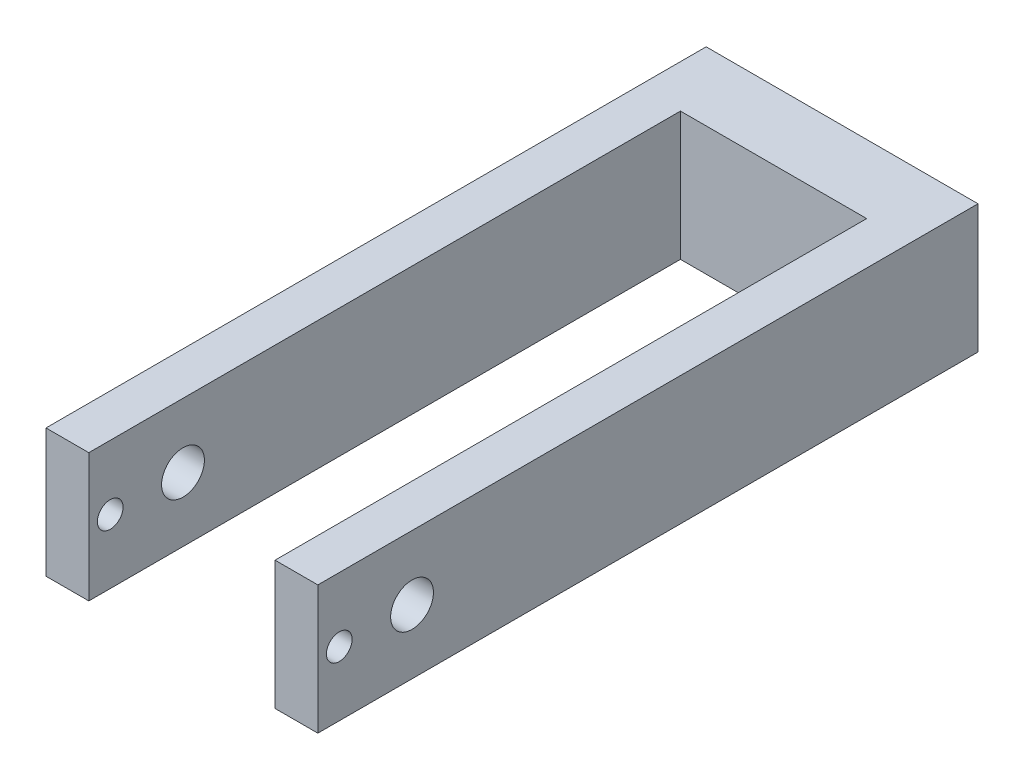
ISO-10303-21;
HEADER;
FILE_DESCRIPTION(('STEP AP214'),'2;1');
FILE_NAME('part.step','',(''),(''),'','','');
FILE_SCHEMA(('AUTOMOTIVE_DESIGN { 1 0 10303 214 1 1 1 1 }'));
ENDSEC;
DATA;
#1=APPLICATION_CONTEXT('core data for automotive mechanical design processes');
#2=APPLICATION_PROTOCOL_DEFINITION('international standard','automotive_design',2000,#1);
#3=PRODUCT_CONTEXT('',#1,'mechanical');
#4=PRODUCT('Part','Part','',(#3));
#5=PRODUCT_RELATED_PRODUCT_CATEGORY('part','',(#4));
#6=PRODUCT_DEFINITION_FORMATION('','',#4);
#7=PRODUCT_DEFINITION_CONTEXT('part definition',#1,'design');
#8=PRODUCT_DEFINITION('design','',#6,#7);
#9=PRODUCT_DEFINITION_SHAPE('','',#8);
#10=(LENGTH_UNIT() NAMED_UNIT(*) SI_UNIT(.MILLI.,.METRE.));
#11=(NAMED_UNIT(*) PLANE_ANGLE_UNIT() SI_UNIT($,.RADIAN.));
#12=(NAMED_UNIT(*) SI_UNIT($,.STERADIAN.) SOLID_ANGLE_UNIT());
#13=UNCERTAINTY_MEASURE_WITH_UNIT(LENGTH_MEASURE(1.E-05),#10,'distance_accuracy_value','');
#14=(GEOMETRIC_REPRESENTATION_CONTEXT(3) GLOBAL_UNCERTAINTY_ASSIGNED_CONTEXT((#13)) GLOBAL_UNIT_ASSIGNED_CONTEXT((#10,
#11,#12)) REPRESENTATION_CONTEXT('',''));
#15=CARTESIAN_POINT('',(0.,0.,0.));
#16=DIRECTION('',(0.,0.,1.));
#17=DIRECTION('',(1.,0.,0.));
#18=AXIS2_PLACEMENT_3D('',#15,#16,#17);
#19=CARTESIAN_POINT('',(0.,0.,8.));
#20=DIRECTION('',(0.,0.,-1.));
#21=DIRECTION('',(-1.,0.,0.));
#22=AXIS2_PLACEMENT_3D('',#19,#20,#21);
#23=PLANE('',#22);
#24=DIRECTION('',(0.,-1.,0.));
#25=VECTOR('',#24,1.);
#26=CARTESIAN_POINT('',(9.94864788732204,8.16903118461885,8.));
#27=LINE('',#26,#25);
#28=CARTESIAN_POINT('',(9.94864788732204,8.16903118461885,8.));
#29=VERTEX_POINT('',#28);
#30=CARTESIAN_POINT('',(9.94864788732204,-6.83096881538115,8.));
#31=VERTEX_POINT('',#30);
#32=EDGE_CURVE('E123',#29,#31,#27,.T.);
#33=ORIENTED_EDGE('',*,*,#32,.F.);
#34=DIRECTION('',(-1.,0.,0.));
#35=VECTOR('',#34,1.);
#36=CARTESIAN_POINT('',(-16.801352112678,8.16903118461885,8.));
#37=LINE('',#36,#35);
#38=CARTESIAN_POINT('',(-11.801352112678,8.16903118461885,8.));
#39=VERTEX_POINT('',#38);
#40=EDGE_CURVE('E155',#29,#39,#37,.T.);
#41=ORIENTED_EDGE('',*,*,#40,.T.);
#42=DIRECTION('',(0.,1.,0.));
#43=VECTOR('',#42,1.);
#44=CARTESIAN_POINT('',(-11.801352112678,8.16903118461885,8.));
#45=LINE('',#44,#43);
#46=CARTESIAN_POINT('',(-11.801352112678,-6.83096881538115,8.));
#47=VERTEX_POINT('',#46);
#48=EDGE_CURVE('E54',#47,#39,#45,.T.);
#49=ORIENTED_EDGE('',*,*,#48,.F.);
#50=DIRECTION('',(1.,0.,0.));
#51=VECTOR('',#50,1.);
#52=CARTESIAN_POINT('',(14.948647887322,-6.83096881538115,8.));
#53=LINE('',#52,#51);
#54=EDGE_CURVE('E49',#47,#31,#53,.T.);
#55=ORIENTED_EDGE('',*,*,#54,.T.);
#56=EDGE_LOOP('',(#33,#41,#49,#55));
#57=FACE_BOUND('',#56,.T.);
#58=ADVANCED_FACE('F32',(#57),#23,.F.);
#59=CARTESIAN_POINT('',(-16.801352112678,-6.83096881538115,8.));
#60=DIRECTION('',(1.,0.,0.));
#61=DIRECTION('',(0.,1.,0.));
#62=AXIS2_PLACEMENT_3D('',#59,#60,#61);
#63=PLANE('',#62);
#64=CARTESIAN_POINT('',(-16.801352112678,0.669031184618845,74.6));
#65=DIRECTION('',(1.,0.,0.));
#66=DIRECTION('',(0.,1.,0.));
#67=AXIS2_PLACEMENT_3D('',#64,#65,#66);
#68=CIRCLE('',#67,1.5);
#69=CARTESIAN_POINT('',(-16.801352112678,2.16903118461884,74.6));
#70=VERTEX_POINT('',#69);
#71=EDGE_CURVE('E194',#70,#70,#68,.T.);
#72=ORIENTED_EDGE('',*,*,#71,.T.);
#73=EDGE_LOOP('',(#72));
#74=FACE_BOUND('',#73,.T.);
#75=CARTESIAN_POINT('',(-16.801352112678,0.669031184618845,66.1));
#76=DIRECTION('',(1.,0.,0.));
#77=DIRECTION('',(0.,1.,0.));
#78=AXIS2_PLACEMENT_3D('',#75,#76,#77);
#79=CIRCLE('',#78,2.50000000000001);
#80=CARTESIAN_POINT('',(-16.801352112678,3.16903118461885,66.1));
#81=VERTEX_POINT('',#80);
#82=EDGE_CURVE('E125',#81,#81,#79,.T.);
#83=ORIENTED_EDGE('',*,*,#82,.T.);
#84=EDGE_LOOP('',(#83));
#85=FACE_BOUND('',#84,.T.);
#86=DIRECTION('',(0.,-1.,0.));
#87=VECTOR('',#86,1.);
#88=CARTESIAN_POINT('',(-16.801352112678,-6.83096881538115,0.));
#89=LINE('',#88,#87);
#90=CARTESIAN_POINT('',(-16.801352112678,8.16903118461885,0.));
#91=VERTEX_POINT('',#90);
#92=CARTESIAN_POINT('',(-16.801352112678,-6.83096881538115,0.));
#93=VERTEX_POINT('',#92);
#94=EDGE_CURVE('E153',#91,#93,#89,.T.);
#95=ORIENTED_EDGE('',*,*,#94,.T.);
#96=DIRECTION('',(0.,0.,-1.));
#97=VECTOR('',#96,1.);
#98=CARTESIAN_POINT('',(-16.801352112678,-6.83096881538115,8.));
#99=LINE('',#98,#97);
#100=CARTESIAN_POINT('',(-16.801352112678,-6.83096881538115,77.1));
#101=VERTEX_POINT('',#100);
#102=EDGE_CURVE('E11',#101,#93,#99,.T.);
#103=ORIENTED_EDGE('',*,*,#102,.F.);
#104=DIRECTION('',(0.,-1.,0.));
#105=VECTOR('',#104,1.);
#106=CARTESIAN_POINT('',(-16.801352112678,-6.83096881538115,77.1));
#107=LINE('',#106,#105);
#108=CARTESIAN_POINT('',(-16.801352112678,8.16903118461885,77.1));
#109=VERTEX_POINT('',#108);
#110=EDGE_CURVE('E136',#109,#101,#107,.T.);
#111=ORIENTED_EDGE('',*,*,#110,.F.);
#112=DIRECTION('',(0.,0.,-1.));
#113=VECTOR('',#112,1.);
#114=CARTESIAN_POINT('',(-16.801352112678,8.16903118461885,8.));
#115=LINE('',#114,#113);
#116=EDGE_CURVE('E108',#109,#91,#115,.T.);
#117=ORIENTED_EDGE('',*,*,#116,.T.);
#118=EDGE_LOOP('',(#95,#103,#111,#117));
#119=FACE_BOUND('',#118,.T.);
#120=ADVANCED_FACE('F34',(#74,#85,#119),#63,.F.);
#121=CARTESIAN_POINT('',(14.948647887322,-6.83096881538115,8.));
#122=DIRECTION('',(0.,1.,0.));
#123=DIRECTION('',(-1.,0.,0.));
#124=AXIS2_PLACEMENT_3D('',#121,#122,#123);
#125=PLANE('',#124);
#126=CARTESIAN_POINT('',(-0.926352112677958,-6.83096881538115,4.));
#127=DIRECTION('',(0.,-1.,0.));
#128=DIRECTION('',(1.,0.,0.));
#129=AXIS2_PLACEMENT_3D('',#126,#127,#128);
#130=CIRCLE('',#129,1.5);
#131=CARTESIAN_POINT('',(0.573647887322042,-6.83096881538115,4.));
#132=VERTEX_POINT('',#131);
#133=EDGE_CURVE('E191',#132,#132,#130,.T.);
#134=ORIENTED_EDGE('',*,*,#133,.F.);
#135=EDGE_LOOP('',(#134));
#136=FACE_BOUND('',#135,.T.);
#137=DIRECTION('',(1.,0.,0.));
#138=VECTOR('',#137,1.);
#139=CARTESIAN_POINT('',(14.948647887322,-6.83096881538115,0.));
#140=LINE('',#139,#138);
#141=CARTESIAN_POINT('',(14.948647887322,-6.83096881538115,0.));
#142=VERTEX_POINT('',#141);
#143=EDGE_CURVE('E160',#93,#142,#140,.T.);
#144=ORIENTED_EDGE('',*,*,#143,.T.);
#145=DIRECTION('',(0.,0.,-1.));
#146=VECTOR('',#145,1.);
#147=CARTESIAN_POINT('',(14.948647887322,-6.83096881538115,8.));
#148=LINE('',#147,#146);
#149=CARTESIAN_POINT('',(14.948647887322,-6.83096881538115,77.1));
#150=VERTEX_POINT('',#149);
#151=EDGE_CURVE('E41',#150,#142,#148,.T.);
#152=ORIENTED_EDGE('',*,*,#151,.F.);
#153=DIRECTION('',(1.,0.,0.));
#154=VECTOR('',#153,1.);
#155=CARTESIAN_POINT('',(9.94864788732204,-6.83096881538115,77.1));
#156=LINE('',#155,#154);
#157=CARTESIAN_POINT('',(9.94864788732204,-6.83096881538115,77.1));
#158=VERTEX_POINT('',#157);
#159=EDGE_CURVE('E122',#158,#150,#156,.T.);
#160=ORIENTED_EDGE('',*,*,#159,.F.);
#161=DIRECTION('',(0.,0.,-1.));
#162=VECTOR('',#161,1.);
#163=CARTESIAN_POINT('',(9.94864788732204,-6.83096881538115,77.1));
#164=LINE('',#163,#162);
#165=EDGE_CURVE('E131',#158,#31,#164,.T.);
#166=ORIENTED_EDGE('',*,*,#165,.T.);
#167=ORIENTED_EDGE('',*,*,#54,.F.);
#168=DIRECTION('',(0.,0.,-1.));
#169=VECTOR('',#168,1.);
#170=CARTESIAN_POINT('',(-11.801352112678,-6.83096881538115,77.1));
#171=LINE('',#170,#169);
#172=CARTESIAN_POINT('',(-11.801352112678,-6.83096881538115,77.1));
#173=VERTEX_POINT('',#172);
#174=EDGE_CURVE('E150',#173,#47,#171,.T.);
#175=ORIENTED_EDGE('',*,*,#174,.F.);
#176=DIRECTION('',(1.,0.,0.));
#177=VECTOR('',#176,1.);
#178=CARTESIAN_POINT('',(-11.801352112678,-6.83096881538115,77.1));
#179=LINE('',#178,#177);
#180=EDGE_CURVE('E139',#101,#173,#179,.T.);
#181=ORIENTED_EDGE('',*,*,#180,.F.);
#182=ORIENTED_EDGE('',*,*,#102,.T.);
#183=EDGE_LOOP('',(#144,#152,#160,#166,#167,#175,#181,#182));
#184=FACE_BOUND('',#183,.T.);
#185=ADVANCED_FACE('F230',(#136,#184),#125,.F.);
#186=CARTESIAN_POINT('',(14.948647887322,8.16903118461885,8.));
#187=DIRECTION('',(-1.,0.,0.));
#188=DIRECTION('',(0.,-1.,0.));
#189=AXIS2_PLACEMENT_3D('',#186,#187,#188);
#190=PLANE('',#189);
#191=CARTESIAN_POINT('',(14.948647887322,0.669031184618852,74.6));
#192=DIRECTION('',(1.,0.,0.));
#193=DIRECTION('',(0.,1.,0.));
#194=AXIS2_PLACEMENT_3D('',#191,#192,#193);
#195=CIRCLE('',#194,1.5);
#196=CARTESIAN_POINT('',(14.948647887322,2.16903118461885,74.6));
#197=VERTEX_POINT('',#196);
#198=EDGE_CURVE('E202',#197,#197,#195,.T.);
#199=ORIENTED_EDGE('',*,*,#198,.F.);
#200=EDGE_LOOP('',(#199));
#201=FACE_BOUND('',#200,.T.);
#202=CARTESIAN_POINT('',(14.948647887322,0.669031184618852,66.1));
#203=DIRECTION('',(1.,0.,0.));
#204=DIRECTION('',(0.,1.,0.));
#205=AXIS2_PLACEMENT_3D('',#202,#203,#204);
#206=CIRCLE('',#205,2.50000000000001);
#207=CARTESIAN_POINT('',(14.948647887322,3.16903118461886,66.1));
#208=VERTEX_POINT('',#207);
#209=EDGE_CURVE('E169',#208,#208,#206,.T.);
#210=ORIENTED_EDGE('',*,*,#209,.F.);
#211=EDGE_LOOP('',(#210));
#212=FACE_BOUND('',#211,.T.);
#213=DIRECTION('',(0.,1.,0.));
#214=VECTOR('',#213,1.);
#215=CARTESIAN_POINT('',(14.948647887322,8.16903118461885,0.));
#216=LINE('',#215,#214);
#217=CARTESIAN_POINT('',(14.948647887322,8.16903118461885,0.));
#218=VERTEX_POINT('',#217);
#219=EDGE_CURVE('E105',#142,#218,#216,.T.);
#220=ORIENTED_EDGE('',*,*,#219,.T.);
#221=DIRECTION('',(0.,0.,-1.));
#222=VECTOR('',#221,1.);
#223=CARTESIAN_POINT('',(14.948647887322,8.16903118461885,8.));
#224=LINE('',#223,#222);
#225=CARTESIAN_POINT('',(14.948647887322,8.16903118461885,77.1));
#226=VERTEX_POINT('',#225);
#227=EDGE_CURVE('E98',#226,#218,#224,.T.);
#228=ORIENTED_EDGE('',*,*,#227,.F.);
#229=DIRECTION('',(0.,1.,0.));
#230=VECTOR('',#229,1.);
#231=CARTESIAN_POINT('',(14.948647887322,-6.83096881538115,77.1));
#232=LINE('',#231,#230);
#233=EDGE_CURVE('E103',#150,#226,#232,.T.);
#234=ORIENTED_EDGE('',*,*,#233,.F.);
#235=ORIENTED_EDGE('',*,*,#151,.T.);
#236=EDGE_LOOP('',(#220,#228,#234,#235));
#237=FACE_BOUND('',#236,.T.);
#238=ADVANCED_FACE('F100',(#201,#212,#237),#190,.F.);
#239=CARTESIAN_POINT('',(-16.801352112678,8.16903118461885,8.));
#240=DIRECTION('',(0.,-1.,0.));
#241=DIRECTION('',(0.,0.,-1.));
#242=AXIS2_PLACEMENT_3D('',#239,#240,#241);
#243=PLANE('',#242);
#244=DIRECTION('',(-1.,0.,0.));
#245=VECTOR('',#244,1.);
#246=CARTESIAN_POINT('',(-16.801352112678,8.16903118461885,0.));
#247=LINE('',#246,#245);
#248=EDGE_CURVE('E156',#218,#91,#247,.T.);
#249=ORIENTED_EDGE('',*,*,#248,.T.);
#250=ORIENTED_EDGE('',*,*,#116,.F.);
#251=DIRECTION('',(-1.,0.,0.));
#252=VECTOR('',#251,1.);
#253=CARTESIAN_POINT('',(-16.801352112678,8.16903118461885,77.1));
#254=LINE('',#253,#252);
#255=CARTESIAN_POINT('',(-11.801352112678,8.16903118461885,77.1));
#256=VERTEX_POINT('',#255);
#257=EDGE_CURVE('E143',#256,#109,#254,.T.);
#258=ORIENTED_EDGE('',*,*,#257,.F.);
#259=DIRECTION('',(0.,0.,-1.));
#260=VECTOR('',#259,1.);
#261=CARTESIAN_POINT('',(-11.801352112678,8.16903118461885,77.1));
#262=LINE('',#261,#260);
#263=EDGE_CURVE('E146',#256,#39,#262,.T.);
#264=ORIENTED_EDGE('',*,*,#263,.T.);
#265=ORIENTED_EDGE('',*,*,#40,.F.);
#266=DIRECTION('',(0.,0.,-1.));
#267=VECTOR('',#266,1.);
#268=CARTESIAN_POINT('',(9.94864788732204,8.16903118461885,77.1));
#269=LINE('',#268,#267);
#270=CARTESIAN_POINT('',(9.94864788732204,8.16903118461885,77.1));
#271=VERTEX_POINT('',#270);
#272=EDGE_CURVE('E114',#271,#29,#269,.T.);
#273=ORIENTED_EDGE('',*,*,#272,.F.);
#274=DIRECTION('',(-1.,0.,0.));
#275=VECTOR('',#274,1.);
#276=CARTESIAN_POINT('',(14.948647887322,8.16903118461885,77.1));
#277=LINE('',#276,#275);
#278=EDGE_CURVE('E111',#226,#271,#277,.T.);
#279=ORIENTED_EDGE('',*,*,#278,.F.);
#280=ORIENTED_EDGE('',*,*,#227,.T.);
#281=EDGE_LOOP('',(#249,#250,#258,#264,#265,#273,#279,#280));
#282=FACE_BOUND('',#281,.T.);
#283=ADVANCED_FACE('F112',(#282),#243,.F.);
#284=CARTESIAN_POINT('',(0.,0.,0.));
#285=DIRECTION('',(0.,0.,-1.));
#286=DIRECTION('',(-1.,0.,0.));
#287=AXIS2_PLACEMENT_3D('',#284,#285,#286);
#288=PLANE('',#287);
#289=CARTESIAN_POINT('',(-0.926352112677959,0.66903118461885,0.));
#290=DIRECTION('',(0.,0.,-1.));
#291=DIRECTION('',(-1.,0.,0.));
#292=AXIS2_PLACEMENT_3D('',#289,#290,#291);
#293=CIRCLE('',#292,4.);
#294=CARTESIAN_POINT('',(-4.92635211267796,0.66903118461885,0.));
#295=VERTEX_POINT('',#294);
#296=EDGE_CURVE('E179',#295,#295,#293,.T.);
#297=ORIENTED_EDGE('',*,*,#296,.F.);
#298=EDGE_LOOP('',(#297));
#299=FACE_BOUND('',#298,.T.);
#300=ORIENTED_EDGE('',*,*,#94,.F.);
#301=ORIENTED_EDGE('',*,*,#248,.F.);
#302=ORIENTED_EDGE('',*,*,#219,.F.);
#303=ORIENTED_EDGE('',*,*,#143,.F.);
#304=EDGE_LOOP('',(#300,#301,#302,#303));
#305=FACE_BOUND('',#304,.T.);
#306=ADVANCED_FACE('F236',(#299,#305),#288,.T.);
#307=CARTESIAN_POINT('',(-11.801352112678,8.16903118461885,77.1));
#308=DIRECTION('',(-1.,0.,0.));
#309=DIRECTION('',(0.,-1.,0.));
#310=AXIS2_PLACEMENT_3D('',#307,#308,#309);
#311=PLANE('',#310);
#312=CARTESIAN_POINT('',(-11.801352112678,0.669031184618846,74.6));
#313=DIRECTION('',(-1.,0.,0.));
#314=DIRECTION('',(0.,-1.,0.));
#315=AXIS2_PLACEMENT_3D('',#312,#313,#314);
#316=CIRCLE('',#315,1.5);
#317=CARTESIAN_POINT('',(-11.801352112678,-0.830968815381151,74.6));
#318=VERTEX_POINT('',#317);
#319=EDGE_CURVE('E199',#318,#318,#316,.T.);
#320=ORIENTED_EDGE('',*,*,#319,.T.);
#321=EDGE_LOOP('',(#320));
#322=FACE_BOUND('',#321,.T.);
#323=CARTESIAN_POINT('',(-11.801352112678,0.669031184618846,66.1));
#324=DIRECTION('',(-1.,0.,0.));
#325=DIRECTION('',(0.,-1.,0.));
#326=AXIS2_PLACEMENT_3D('',#323,#324,#325);
#327=CIRCLE('',#326,2.50000000000001);
#328=CARTESIAN_POINT('',(-11.801352112678,-1.83096881538116,66.1));
#329=VERTEX_POINT('',#328);
#330=EDGE_CURVE('E168',#329,#329,#327,.T.);
#331=ORIENTED_EDGE('',*,*,#330,.T.);
#332=EDGE_LOOP('',(#331));
#333=FACE_BOUND('',#332,.T.);
#334=ORIENTED_EDGE('',*,*,#48,.T.);
#335=ORIENTED_EDGE('',*,*,#263,.F.);
#336=DIRECTION('',(0.,1.,0.));
#337=VECTOR('',#336,1.);
#338=CARTESIAN_POINT('',(-11.801352112678,8.16903118461885,77.1));
#339=LINE('',#338,#337);
#340=EDGE_CURVE('E141',#173,#256,#339,.T.);
#341=ORIENTED_EDGE('',*,*,#340,.F.);
#342=ORIENTED_EDGE('',*,*,#174,.T.);
#343=EDGE_LOOP('',(#334,#335,#341,#342));
#344=FACE_BOUND('',#343,.T.);
#345=ADVANCED_FACE('F234',(#322,#333,#344),#311,.F.);
#346=CARTESIAN_POINT('',(0.,0.,77.1));
#347=DIRECTION('',(0.,0.,-1.));
#348=DIRECTION('',(-1.,0.,0.));
#349=AXIS2_PLACEMENT_3D('',#346,#347,#348);
#350=PLANE('',#349);
#351=ORIENTED_EDGE('',*,*,#110,.T.);
#352=ORIENTED_EDGE('',*,*,#180,.T.);
#353=ORIENTED_EDGE('',*,*,#340,.T.);
#354=ORIENTED_EDGE('',*,*,#257,.T.);
#355=EDGE_LOOP('',(#351,#352,#353,#354));
#356=FACE_BOUND('',#355,.T.);
#357=ADVANCED_FACE('F259',(#356),#350,.F.);
#358=CARTESIAN_POINT('',(9.94864788732204,8.16903118461885,77.1));
#359=DIRECTION('',(1.,0.,0.));
#360=DIRECTION('',(0.,1.,0.));
#361=AXIS2_PLACEMENT_3D('',#358,#359,#360);
#362=PLANE('',#361);
#363=CARTESIAN_POINT('',(9.94864788732204,0.669031184618851,74.6));
#364=DIRECTION('',(1.,0.,0.));
#365=DIRECTION('',(0.,1.,0.));
#366=AXIS2_PLACEMENT_3D('',#363,#364,#365);
#367=CIRCLE('',#366,1.5);
#368=CARTESIAN_POINT('',(9.94864788732204,2.16903118461885,74.6));
#369=VERTEX_POINT('',#368);
#370=EDGE_CURVE('E36',#369,#369,#367,.T.);
#371=ORIENTED_EDGE('',*,*,#370,.T.);
#372=EDGE_LOOP('',(#371));
#373=FACE_BOUND('',#372,.T.);
#374=CARTESIAN_POINT('',(9.94864788732204,0.669031184618851,66.1));
#375=DIRECTION('',(1.,0.,0.));
#376=DIRECTION('',(0.,1.,0.));
#377=AXIS2_PLACEMENT_3D('',#374,#375,#376);
#378=CIRCLE('',#377,2.50000000000001);
#379=CARTESIAN_POINT('',(9.94864788732204,3.16903118461886,66.1));
#380=VERTEX_POINT('',#379);
#381=EDGE_CURVE('E166',#380,#380,#378,.T.);
#382=ORIENTED_EDGE('',*,*,#381,.T.);
#383=EDGE_LOOP('',(#382));
#384=FACE_BOUND('',#383,.T.);
#385=ORIENTED_EDGE('',*,*,#32,.T.);
#386=ORIENTED_EDGE('',*,*,#165,.F.);
#387=DIRECTION('',(0.,-1.,0.));
#388=VECTOR('',#387,1.);
#389=CARTESIAN_POINT('',(9.94864788732204,8.16903118461885,77.1));
#390=LINE('',#389,#388);
#391=EDGE_CURVE('E117',#271,#158,#390,.T.);
#392=ORIENTED_EDGE('',*,*,#391,.F.);
#393=ORIENTED_EDGE('',*,*,#272,.T.);
#394=EDGE_LOOP('',(#385,#386,#392,#393));
#395=FACE_BOUND('',#394,.T.);
#396=ADVANCED_FACE('F209',(#373,#384,#395),#362,.F.);
#397=CARTESIAN_POINT('',(0.,0.,77.1));
#398=DIRECTION('',(0.,0.,1.));
#399=DIRECTION('',(1.,0.,0.));
#400=AXIS2_PLACEMENT_3D('',#397,#398,#399);
#401=PLANE('',#400);
#402=ORIENTED_EDGE('',*,*,#233,.T.);
#403=ORIENTED_EDGE('',*,*,#278,.T.);
#404=ORIENTED_EDGE('',*,*,#391,.T.);
#405=ORIENTED_EDGE('',*,*,#159,.T.);
#406=EDGE_LOOP('',(#402,#403,#404,#405));
#407=FACE_BOUND('',#406,.T.);
#408=ADVANCED_FACE('F120',(#407),#401,.T.);
#409=CARTESIAN_POINT('',(-54.1513521126779,0.669031184618836,66.1));
#410=DIRECTION('',(1.,0.,0.));
#411=DIRECTION('',(0.,1.,0.));
#412=AXIS2_PLACEMENT_3D('',#409,#410,#411);
#413=CYLINDRICAL_SURFACE('',#412,2.50000000000001);
#414=ORIENTED_EDGE('',*,*,#209,.T.);
#415=EDGE_LOOP('',(#414));
#416=FACE_BOUND('',#415,.T.);
#417=ORIENTED_EDGE('',*,*,#381,.F.);
#418=EDGE_LOOP('',(#417));
#419=FACE_BOUND('',#418,.T.);
#420=ADVANCED_FACE('F272',(#416,#419),#413,.F.);
#421=ORIENTED_EDGE('',*,*,#330,.F.);
#422=EDGE_LOOP('',(#421));
#423=FACE_BOUND('',#422,.T.);
#424=ORIENTED_EDGE('',*,*,#82,.F.);
#425=EDGE_LOOP('',(#424));
#426=FACE_BOUND('',#425,.T.);
#427=ADVANCED_FACE('F276',(#423,#426),#413,.F.);
#428=CARTESIAN_POINT('',(-0.926352112677959,0.66903118461885,4.));
#429=DIRECTION('',(0.,0.,-1.));
#430=DIRECTION('',(-1.,0.,0.));
#431=AXIS2_PLACEMENT_3D('',#428,#429,#430);
#432=CYLINDRICAL_SURFACE('',#431,4.);
#433=CARTESIAN_POINT('',(-0.926352112677959,0.66903118461885,4.));
#434=DIRECTION('',(0.,0.,-1.));
#435=DIRECTION('',(-1.,0.,0.));
#436=AXIS2_PLACEMENT_3D('',#433,#434,#435);
#437=CIRCLE('',#436,4.);
#438=CARTESIAN_POINT('',(-4.92635211267796,0.66903118461885,4.));
#439=VERTEX_POINT('',#438);
#440=EDGE_CURVE('E174',#439,#439,#437,.T.);
#441=ORIENTED_EDGE('',*,*,#440,.F.);
#442=EDGE_LOOP('',(#441));
#443=FACE_BOUND('',#442,.T.);
#444=ORIENTED_EDGE('',*,*,#296,.T.);
#445=EDGE_LOOP('',(#444));
#446=FACE_BOUND('',#445,.T.);
#447=ADVANCED_FACE('F279',(#443,#446),#432,.F.);
#448=CARTESIAN_POINT('',(-0.926352112677959,0.66903118461885,4.));
#449=DIRECTION('',(0.,0.,-1.));
#450=DIRECTION('',(-1.,0.,0.));
#451=AXIS2_PLACEMENT_3D('',#448,#449,#450);
#452=PLANE('',#451);
#453=CARTESIAN_POINT('',(-0.926352112677959,0.66903118461885,4.));
#454=DIRECTION('',(0.,0.,-1.));
#455=DIRECTION('',(-1.,0.,0.));
#456=AXIS2_PLACEMENT_3D('',#453,#454,#455);
#457=CIRCLE('',#456,2.);
#458=CARTESIAN_POINT('',(-2.92635211267796,0.66903118461885,4.));
#459=VERTEX_POINT('',#458);
#460=EDGE_CURVE('E183',#459,#459,#457,.T.);
#461=ORIENTED_EDGE('',*,*,#460,.F.);
#462=EDGE_LOOP('',(#461));
#463=FACE_BOUND('',#462,.T.);
#464=ORIENTED_EDGE('',*,*,#440,.T.);
#465=EDGE_LOOP('',(#464));
#466=FACE_BOUND('',#465,.T.);
#467=ADVANCED_FACE('F283',(#463,#466),#452,.T.);
#468=CARTESIAN_POINT('',(-0.926352112677959,0.66903118461885,4.));
#469=DIRECTION('',(0.,0.,-1.));
#470=DIRECTION('',(-1.,0.,0.));
#471=AXIS2_PLACEMENT_3D('',#468,#469,#470);
#472=CYLINDRICAL_SURFACE('',#471,2.);
#473=ORIENTED_EDGE('',*,*,#460,.T.);
#474=EDGE_LOOP('',(#473));
#475=FACE_BOUND('',#474,.T.);
#476=CARTESIAN_POINT('',(-0.926352112677959,0.66903118461885,0.));
#477=DIRECTION('',(0.,0.,-1.));
#478=DIRECTION('',(-1.,0.,0.));
#479=AXIS2_PLACEMENT_3D('',#476,#477,#478);
#480=CIRCLE('',#479,2.);
#481=CARTESIAN_POINT('',(-2.92635211267796,0.66903118461885,0.));
#482=VERTEX_POINT('',#481);
#483=EDGE_CURVE('E185',#482,#482,#480,.T.);
#484=ORIENTED_EDGE('',*,*,#483,.F.);
#485=EDGE_LOOP('',(#484));
#486=FACE_BOUND('',#485,.T.);
#487=ADVANCED_FACE('F287',(#475,#486),#472,.T.);
#488=ORIENTED_EDGE('',*,*,#483,.T.);
#489=EDGE_LOOP('',(#488));
#490=FACE_BOUND('',#489,.T.);
#491=ADVANCED_FACE('F240',(#490),#288,.T.);
#492=CARTESIAN_POINT('',(-0.926352112677959,-3.83096881538115,4.));
#493=DIRECTION('',(0.,-1.,0.));
#494=DIRECTION('',(1.,0.,0.));
#495=AXIS2_PLACEMENT_3D('',#492,#493,#494);
#496=CYLINDRICAL_SURFACE('',#495,1.5);
#497=CARTESIAN_POINT('',(-0.926352112677959,-3.83096881538115,4.));
#498=DIRECTION('',(0.,-1.,0.));
#499=DIRECTION('',(1.,0.,0.));
#500=AXIS2_PLACEMENT_3D('',#497,#498,#499);
#501=CIRCLE('',#500,1.5);
#502=CARTESIAN_POINT('',(0.573647887322042,-3.83096881538115,4.));
#503=VERTEX_POINT('',#502);
#504=EDGE_CURVE('E188',#503,#503,#501,.T.);
#505=ORIENTED_EDGE('',*,*,#504,.F.);
#506=EDGE_LOOP('',(#505));
#507=FACE_BOUND('',#506,.T.);
#508=ORIENTED_EDGE('',*,*,#133,.T.);
#509=EDGE_LOOP('',(#508));
#510=FACE_BOUND('',#509,.T.);
#511=ADVANCED_FACE('F221',(#507,#510),#496,.F.);
#512=CARTESIAN_POINT('',(-0.926352112677959,-3.83096881538115,4.));
#513=DIRECTION('',(0.,-1.,0.));
#514=DIRECTION('',(1.,0.,0.));
#515=AXIS2_PLACEMENT_3D('',#512,#513,#514);
#516=PLANE('',#515);
#517=ORIENTED_EDGE('',*,*,#504,.T.);
#518=EDGE_LOOP('',(#517));
#519=FACE_BOUND('',#518,.T.);
#520=ADVANCED_FACE('F214',(#519),#516,.T.);
#521=CARTESIAN_POINT('',(-22.051352112678,0.669031184618843,74.6));
#522=DIRECTION('',(1.,0.,0.));
#523=DIRECTION('',(0.,1.,0.));
#524=AXIS2_PLACEMENT_3D('',#521,#522,#523);
#525=CYLINDRICAL_SURFACE('',#524,1.5);
#526=ORIENTED_EDGE('',*,*,#198,.T.);
#527=EDGE_LOOP('',(#526));
#528=FACE_BOUND('',#527,.T.);
#529=ORIENTED_EDGE('',*,*,#370,.F.);
#530=EDGE_LOOP('',(#529));
#531=FACE_BOUND('',#530,.T.);
#532=ADVANCED_FACE('F211',(#528,#531),#525,.F.);
#533=ORIENTED_EDGE('',*,*,#319,.F.);
#534=EDGE_LOOP('',(#533));
#535=FACE_BOUND('',#534,.T.);
#536=ORIENTED_EDGE('',*,*,#71,.F.);
#537=EDGE_LOOP('',(#536));
#538=FACE_BOUND('',#537,.T.);
#539=ADVANCED_FACE('F213',(#535,#538),#525,.F.);
#540=CLOSED_SHELL('',(#58,#120,#185,#238,#283,#306,#345,#357,#396,#408,#420,#427,#447,#467,#487,
#491,#511,#520,#532,#539));
#541=MANIFOLD_SOLID_BREP('B2',#540);
#542=ADVANCED_BREP_SHAPE_REPRESENTATION('',(#18,#541),#14);
#543=SHAPE_DEFINITION_REPRESENTATION(#9,#542);
ENDSEC;
END-ISO-10303-21;
